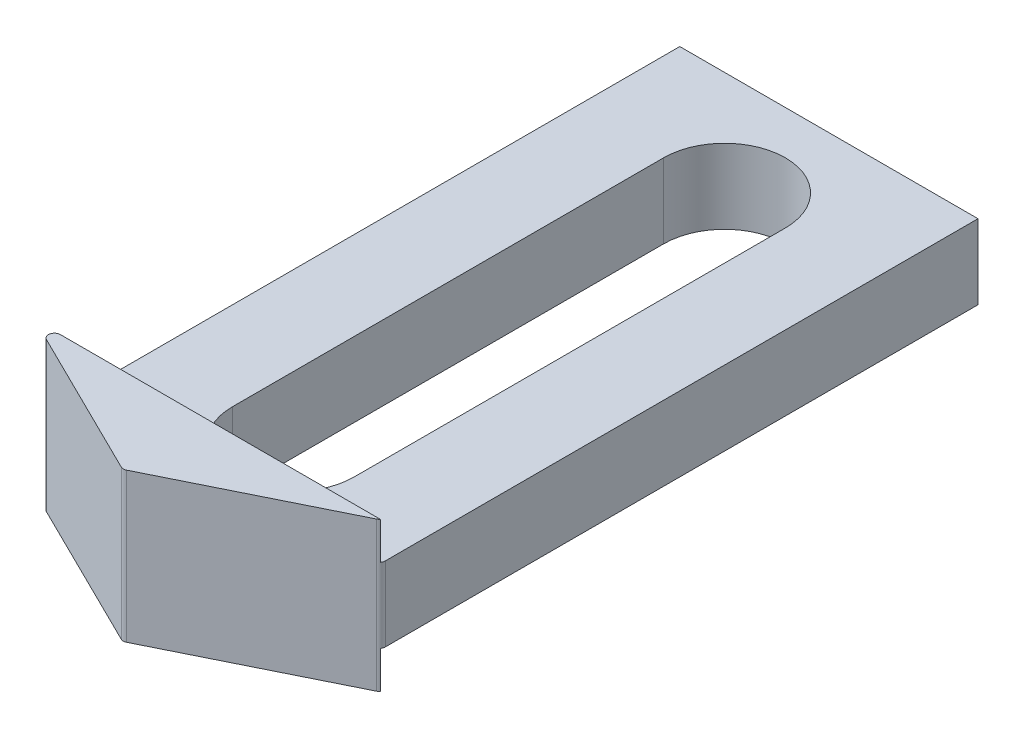
ISO-10303-21;
HEADER;
FILE_DESCRIPTION(('STEP AP214'),'2;1');
FILE_NAME('part.step','',(''),(''),'','','');
FILE_SCHEMA(('AUTOMOTIVE_DESIGN { 1 0 10303 214 1 1 1 1 }'));
ENDSEC;
DATA;
#1=APPLICATION_CONTEXT('core data for automotive mechanical design processes');
#2=APPLICATION_PROTOCOL_DEFINITION('international standard','automotive_design',2000,#1);
#3=PRODUCT_CONTEXT('',#1,'mechanical');
#4=PRODUCT('Part','Part','',(#3));
#5=PRODUCT_RELATED_PRODUCT_CATEGORY('part','',(#4));
#6=PRODUCT_DEFINITION_FORMATION('','',#4);
#7=PRODUCT_DEFINITION_CONTEXT('part definition',#1,'design');
#8=PRODUCT_DEFINITION('design','',#6,#7);
#9=PRODUCT_DEFINITION_SHAPE('','',#8);
#10=(LENGTH_UNIT() NAMED_UNIT(*) SI_UNIT(.MILLI.,.METRE.));
#11=(NAMED_UNIT(*) PLANE_ANGLE_UNIT() SI_UNIT($,.RADIAN.));
#12=(NAMED_UNIT(*) SI_UNIT($,.STERADIAN.) SOLID_ANGLE_UNIT());
#13=UNCERTAINTY_MEASURE_WITH_UNIT(LENGTH_MEASURE(1.E-05),#10,'distance_accuracy_value','');
#14=(GEOMETRIC_REPRESENTATION_CONTEXT(3) GLOBAL_UNCERTAINTY_ASSIGNED_CONTEXT((#13)) GLOBAL_UNIT_ASSIGNED_CONTEXT((#10,
#11,#12)) REPRESENTATION_CONTEXT('',''));
#15=CARTESIAN_POINT('',(0.,0.,0.));
#16=DIRECTION('',(0.,0.,1.));
#17=DIRECTION('',(1.,0.,0.));
#18=AXIS2_PLACEMENT_3D('',#15,#16,#17);
#19=CARTESIAN_POINT('',(0.,3.175,0.));
#20=DIRECTION('',(0.,0.,-1.));
#21=DIRECTION('',(-1.,0.,0.));
#22=AXIS2_PLACEMENT_3D('',#19,#20,#21);
#23=PLANE('',#22);
#24=DIRECTION('',(0.,-1.,0.));
#25=VECTOR('',#24,1.);
#26=CARTESIAN_POINT('',(1.49142990286922,3.175,0.));
#27=LINE('',#26,#25);
#28=CARTESIAN_POINT('',(1.49142990286922,-3.175,0.));
#29=VERTEX_POINT('',#28);
#30=CARTESIAN_POINT('',(1.49142990286922,3.175,0.));
#31=VERTEX_POINT('',#30);
#32=EDGE_CURVE('E192',#29,#31,#27,.F.);
#33=ORIENTED_EDGE('',*,*,#32,.T.);
#34=DIRECTION('',(1.,0.,0.));
#35=VECTOR('',#34,1.);
#36=CARTESIAN_POINT('',(0.,3.175,0.));
#37=LINE('',#36,#35);
#38=CARTESIAN_POINT('',(15.1141063698207,3.175,0.));
#39=VERTEX_POINT('',#38);
#40=EDGE_CURVE('E275',#31,#39,#37,.T.);
#41=ORIENTED_EDGE('',*,*,#40,.T.);
#42=DIRECTION('',(0.,1.,0.));
#43=VECTOR('',#42,1.);
#44=CARTESIAN_POINT('',(15.1141063698207,3.175,0.));
#45=LINE('',#44,#43);
#46=CARTESIAN_POINT('',(15.1141063698207,1.5875,0.));
#47=VERTEX_POINT('',#46);
#48=EDGE_CURVE('E265',#39,#47,#45,.F.);
#49=ORIENTED_EDGE('',*,*,#48,.T.);
#50=DIRECTION('',(-1.,0.,0.));
#51=VECTOR('',#50,1.);
#52=CARTESIAN_POINT('',(15.1691141584862,1.5875,0.));
#53=LINE('',#52,#51);
#54=CARTESIAN_POINT('',(8.81911415848617,1.5875,0.));
#55=VERTEX_POINT('',#54);
#56=EDGE_CURVE('E59',#47,#55,#53,.T.);
#57=ORIENTED_EDGE('',*,*,#56,.T.);
#58=CARTESIAN_POINT('',(2.21511415848617,1.5875,0.));
#59=VERTEX_POINT('',#58);
#60=EDGE_CURVE('E186',#55,#59,#53,.T.);
#61=ORIENTED_EDGE('',*,*,#60,.T.);
#62=DIRECTION('',(0.,-1.,0.));
#63=VECTOR('',#62,1.);
#64=CARTESIAN_POINT('',(2.21511415848617,3.175,0.));
#65=LINE('',#64,#63);
#66=CARTESIAN_POINT('',(2.21511415848617,-1.5875,0.));
#67=VERTEX_POINT('',#66);
#68=EDGE_CURVE('E196',#59,#67,#65,.T.);
#69=ORIENTED_EDGE('',*,*,#68,.T.);
#70=DIRECTION('',(-1.,0.,0.));
#71=VECTOR('',#70,1.);
#72=CARTESIAN_POINT('',(15.1691141584862,-1.5875,0.));
#73=LINE('',#72,#71);
#74=CARTESIAN_POINT('',(8.81911415848617,-1.5875,0.));
#75=VERTEX_POINT('',#74);
#76=EDGE_CURVE('E390',#75,#67,#73,.T.);
#77=ORIENTED_EDGE('',*,*,#76,.F.);
#78=CARTESIAN_POINT('',(15.1141063698207,-1.5875,0.));
#79=VERTEX_POINT('',#78);
#80=EDGE_CURVE('E67',#79,#75,#73,.T.);
#81=ORIENTED_EDGE('',*,*,#80,.F.);
#82=DIRECTION('',(0.,1.,0.));
#83=VECTOR('',#82,1.);
#84=CARTESIAN_POINT('',(15.1141063698207,3.175,0.));
#85=LINE('',#84,#83);
#86=CARTESIAN_POINT('',(15.1141063698207,-3.175,0.));
#87=VERTEX_POINT('',#86);
#88=EDGE_CURVE('E271',#79,#87,#85,.F.);
#89=ORIENTED_EDGE('',*,*,#88,.T.);
#90=DIRECTION('',(1.,0.,0.));
#91=VECTOR('',#90,1.);
#92=CARTESIAN_POINT('',(0.,-3.175,0.));
#93=LINE('',#92,#91);
#94=EDGE_CURVE('E286',#29,#87,#93,.T.);
#95=ORIENTED_EDGE('',*,*,#94,.F.);
#96=EDGE_LOOP('',(#33,#41,#49,#57,#61,#69,#77,#81,#89,#95));
#97=FACE_BOUND('',#96,.T.);
#98=ADVANCED_FACE('F43',(#97),#23,.T.);
#99=CARTESIAN_POINT('',(0.0790770314002346,3.175,-0.160139833938414));
#100=DIRECTION('',(-0.442760649996561,0.,0.896639842308283));
#101=DIRECTION('',(0.896639842308283,0.,0.442760649996561));
#102=AXIS2_PLACEMENT_3D('',#99,#100,#101);
#103=PLANE('',#102);
#104=DIRECTION('',(-0.896639842308283,0.,-0.442760649996561));
#105=VECTOR('',#104,1.);
#106=CARTESIAN_POINT('',(0.0790770314002346,3.175,-0.160139833938414));
#107=LINE('',#106,#105);
#108=CARTESIAN_POINT('',(7.67378492812128,3.175,3.59012604341715));
#109=VERTEX_POINT('',#108);
#110=CARTESIAN_POINT('',(1.3789686977701,3.175,0.481746519946304));
#111=VERTEX_POINT('',#110);
#112=EDGE_CURVE('E278',#109,#111,#107,.T.);
#113=ORIENTED_EDGE('',*,*,#112,.T.);
#114=DIRECTION('',(0.,-1.,0.));
#115=VECTOR('',#114,1.);
#116=CARTESIAN_POINT('',(1.3789686977701,3.175,0.481746519946304));
#117=LINE('',#116,#115);
#118=CARTESIAN_POINT('',(1.3789686977701,-3.175,0.481746519946304));
#119=VERTEX_POINT('',#118);
#120=EDGE_CURVE('E241',#111,#119,#117,.T.);
#121=ORIENTED_EDGE('',*,*,#120,.T.);
#122=DIRECTION('',(-0.896639842308283,0.,-0.442760649996561));
#123=VECTOR('',#122,1.);
#124=CARTESIAN_POINT('',(0.0790770314002346,-3.175,-0.160139833938414));
#125=LINE('',#124,#123);
#126=CARTESIAN_POINT('',(7.67378492812128,-3.175,3.59012604341715));
#127=VERTEX_POINT('',#126);
#128=EDGE_CURVE('E289',#127,#119,#125,.T.);
#129=ORIENTED_EDGE('',*,*,#128,.F.);
#130=DIRECTION('',(0.,-1.,0.));
#131=VECTOR('',#130,1.);
#132=CARTESIAN_POINT('',(7.67378492812128,3.175,3.59012604341715));
#133=LINE('',#132,#131);
#134=EDGE_CURVE('E238',#127,#109,#133,.F.);
#135=ORIENTED_EDGE('',*,*,#134,.T.);
#136=EDGE_LOOP('',(#113,#121,#129,#135));
#137=FACE_BOUND('',#136,.T.);
#138=ADVANCED_FACE('F319',(#137),#103,.T.);
#139=CARTESIAN_POINT('',(2.97370752891536,3.175,6.0220903773141));
#140=DIRECTION('',(0.442760649996561,0.,0.896639842308283));
#141=DIRECTION('',(0.896639842308283,0.,-0.442760649996561));
#142=AXIS2_PLACEMENT_3D('',#139,#140,#141);
#143=PLANE('',#142);
#144=DIRECTION('',(-0.896639842308283,0.,0.442760649996561));
#145=VECTOR('',#144,1.);
#146=CARTESIAN_POINT('',(2.97370752891536,-3.175,6.0220903773141));
#147=LINE('',#146,#145);
#148=CARTESIAN_POINT('',(15.0275753635853,-3.175,0.0698918404838109));
#149=VERTEX_POINT('',#148);
#150=CARTESIAN_POINT('',(7.89870733831954,-3.175,3.59012604341715));
#151=VERTEX_POINT('',#150);
#152=EDGE_CURVE('E279',#149,#151,#147,.T.);
#153=ORIENTED_EDGE('',*,*,#152,.F.);
#154=DIRECTION('',(0.,-1.,0.));
#155=VECTOR('',#154,1.);
#156=CARTESIAN_POINT('',(15.0275753635853,3.175,0.0698918404838117));
#157=LINE('',#156,#155);
#158=CARTESIAN_POINT('',(15.0275753635853,3.175,0.0698918404838109));
#159=VERTEX_POINT('',#158);
#160=EDGE_CURVE('E225',#149,#159,#157,.F.);
#161=ORIENTED_EDGE('',*,*,#160,.T.);
#162=DIRECTION('',(-0.896639842308283,0.,0.442760649996561));
#163=VECTOR('',#162,1.);
#164=CARTESIAN_POINT('',(2.97370752891536,3.175,6.0220903773141));
#165=LINE('',#164,#163);
#166=CARTESIAN_POINT('',(7.89870733831954,3.175,3.59012604341715));
#167=VERTEX_POINT('',#166);
#168=EDGE_CURVE('E198',#159,#167,#165,.T.);
#169=ORIENTED_EDGE('',*,*,#168,.T.);
#170=DIRECTION('',(0.,-1.,0.));
#171=VECTOR('',#170,1.);
#172=CARTESIAN_POINT('',(7.89870733831953,3.175,3.59012604341715));
#173=LINE('',#172,#171);
#174=EDGE_CURVE('E221',#167,#151,#173,.T.);
#175=ORIENTED_EDGE('',*,*,#174,.T.);
#176=EDGE_LOOP('',(#153,#161,#169,#175));
#177=FACE_BOUND('',#176,.T.);
#178=ADVANCED_FACE('F302',(#177),#143,.T.);
#179=CARTESIAN_POINT('',(15.1691141584862,3.175,0.));
#180=DIRECTION('',(-1.,0.,0.));
#181=DIRECTION('',(0.,0.,1.));
#182=AXIS2_PLACEMENT_3D('',#179,#180,#181);
#183=PLANE('',#182);
#184=DIRECTION('',(0.,-1.,0.));
#185=VECTOR('',#184,1.);
#186=CARTESIAN_POINT('',(15.1691141584862,3.175,-25.4));
#187=LINE('',#186,#185);
#188=CARTESIAN_POINT('',(15.1691141584862,1.5875,-25.4));
#189=VERTEX_POINT('',#188);
#190=CARTESIAN_POINT('',(15.1691141584862,-1.5875,-25.4));
#191=VERTEX_POINT('',#190);
#192=EDGE_CURVE('E182',#189,#191,#187,.T.);
#193=ORIENTED_EDGE('',*,*,#192,.F.);
#194=DIRECTION('',(0.,0.,1.));
#195=VECTOR('',#194,1.);
#196=CARTESIAN_POINT('',(15.1691141584862,1.5875,-25.4));
#197=LINE('',#196,#195);
#198=CARTESIAN_POINT('',(15.1691141584862,1.5875,-0.157854679462492));
#199=VERTEX_POINT('',#198);
#200=EDGE_CURVE('E163',#189,#199,#197,.T.);
#201=ORIENTED_EDGE('',*,*,#200,.T.);
#202=DIRECTION('',(0.,-1.,0.));
#203=VECTOR('',#202,1.);
#204=CARTESIAN_POINT('',(15.1691141584862,-3.175,-0.157854679462492));
#205=LINE('',#204,#203);
#206=CARTESIAN_POINT('',(15.1691141584862,-1.5875,-0.157854679462492));
#207=VERTEX_POINT('',#206);
#208=EDGE_CURVE('E209',#199,#207,#205,.T.);
#209=ORIENTED_EDGE('',*,*,#208,.T.);
#210=DIRECTION('',(0.,0.,-1.));
#211=VECTOR('',#210,1.);
#212=CARTESIAN_POINT('',(15.1691141584862,-1.5875,-25.4));
#213=LINE('',#212,#211);
#214=EDGE_CURVE('E190',#207,#191,#213,.T.);
#215=ORIENTED_EDGE('',*,*,#214,.T.);
#216=EDGE_LOOP('',(#193,#201,#209,#215));
#217=FACE_BOUND('',#216,.T.);
#218=ADVANCED_FACE('F189',(#217),#183,.F.);
#219=CARTESIAN_POINT('',(0.,3.175,-25.4));
#220=DIRECTION('',(0.,0.,-1.));
#221=DIRECTION('',(-1.,0.,0.));
#222=AXIS2_PLACEMENT_3D('',#219,#220,#221);
#223=PLANE('',#222);
#224=DIRECTION('',(-1.,0.,0.));
#225=VECTOR('',#224,1.);
#226=CARTESIAN_POINT('',(15.1691141584862,1.5875,-25.4));
#227=LINE('',#226,#225);
#228=CARTESIAN_POINT('',(2.46911415848617,1.5875,-25.4));
#229=VERTEX_POINT('',#228);
#230=EDGE_CURVE('E166',#189,#229,#227,.T.);
#231=ORIENTED_EDGE('',*,*,#230,.F.);
#232=ORIENTED_EDGE('',*,*,#192,.T.);
#233=DIRECTION('',(-1.,0.,0.));
#234=VECTOR('',#233,1.);
#235=CARTESIAN_POINT('',(15.1691141584862,-1.5875,-25.4));
#236=LINE('',#235,#234);
#237=CARTESIAN_POINT('',(2.46911415848617,-1.5875,-25.4));
#238=VERTEX_POINT('',#237);
#239=EDGE_CURVE('E175',#191,#238,#236,.T.);
#240=ORIENTED_EDGE('',*,*,#239,.T.);
#241=DIRECTION('',(0.,-1.,0.));
#242=VECTOR('',#241,1.);
#243=CARTESIAN_POINT('',(2.46911415848617,3.175,-25.4));
#244=LINE('',#243,#242);
#245=EDGE_CURVE('E184',#229,#238,#244,.T.);
#246=ORIENTED_EDGE('',*,*,#245,.F.);
#247=EDGE_LOOP('',(#231,#232,#240,#246));
#248=FACE_BOUND('',#247,.T.);
#249=ADVANCED_FACE('F180',(#248),#223,.T.);
#250=CARTESIAN_POINT('',(2.46911415848617,3.175,0.));
#251=DIRECTION('',(1.,0.,0.));
#252=DIRECTION('',(0.,0.,-1.));
#253=AXIS2_PLACEMENT_3D('',#250,#251,#252);
#254=PLANE('',#253);
#255=DIRECTION('',(0.,-1.,0.));
#256=VECTOR('',#255,1.);
#257=CARTESIAN_POINT('',(2.46911415848617,3.175,-0.254));
#258=LINE('',#257,#256);
#259=CARTESIAN_POINT('',(2.46911415848617,-1.5875,-0.254));
#260=VERTEX_POINT('',#259);
#261=CARTESIAN_POINT('',(2.46911415848617,1.5875,-0.254));
#262=VERTEX_POINT('',#261);
#263=EDGE_CURVE('E205',#260,#262,#258,.F.);
#264=ORIENTED_EDGE('',*,*,#263,.T.);
#265=DIRECTION('',(0.,0.,-1.));
#266=VECTOR('',#265,1.);
#267=CARTESIAN_POINT('',(2.46911415848617,1.5875,0.));
#268=LINE('',#267,#266);
#269=EDGE_CURVE('E327',#262,#229,#268,.T.);
#270=ORIENTED_EDGE('',*,*,#269,.T.);
#271=ORIENTED_EDGE('',*,*,#245,.T.);
#272=DIRECTION('',(0.,0.,1.));
#273=VECTOR('',#272,1.);
#274=CARTESIAN_POINT('',(2.46911415848617,-1.5875,0.));
#275=LINE('',#274,#273);
#276=EDGE_CURVE('E358',#238,#260,#275,.T.);
#277=ORIENTED_EDGE('',*,*,#276,.T.);
#278=EDGE_LOOP('',(#264,#270,#271,#277));
#279=FACE_BOUND('',#278,.T.);
#280=ADVANCED_FACE('F375',(#279),#254,.F.);
#281=CARTESIAN_POINT('',(0.,3.175,0.));
#282=DIRECTION('',(0.,1.,0.));
#283=DIRECTION('',(0.,0.,1.));
#284=AXIS2_PLACEMENT_3D('',#281,#282,#283);
#285=PLANE('',#284);
#286=CARTESIAN_POINT('',(14.9151141584862,3.175,-0.157854679462492));
#287=DIRECTION('',(0.,1.,0.));
#288=DIRECTION('',(0.,0.,1.));
#289=AXIS2_PLACEMENT_3D('',#286,#287,#288);
#290=CIRCLE('',#289,0.254);
#291=EDGE_CURVE('E234',#159,#39,#290,.T.);
#292=ORIENTED_EDGE('',*,*,#291,.T.);
#293=ORIENTED_EDGE('',*,*,#40,.F.);
#294=CARTESIAN_POINT('',(1.49142990286922,3.175,0.254));
#295=DIRECTION('',(0.,1.,0.));
#296=DIRECTION('',(0.,0.,1.));
#297=AXIS2_PLACEMENT_3D('',#294,#295,#296);
#298=CIRCLE('',#297,0.254);
#299=EDGE_CURVE('E231',#31,#111,#298,.T.);
#300=ORIENTED_EDGE('',*,*,#299,.T.);
#301=ORIENTED_EDGE('',*,*,#112,.F.);
#302=CARTESIAN_POINT('',(7.78624613322041,3.175,3.36237952347084));
#303=DIRECTION('',(0.,1.,0.));
#304=DIRECTION('',(0.,0.,1.));
#305=AXIS2_PLACEMENT_3D('',#302,#303,#304);
#306=CIRCLE('',#305,0.254);
#307=EDGE_CURVE('E228',#109,#167,#306,.T.);
#308=ORIENTED_EDGE('',*,*,#307,.T.);
#309=ORIENTED_EDGE('',*,*,#168,.F.);
#310=EDGE_LOOP('',(#292,#293,#300,#301,#308,#309));
#311=FACE_BOUND('',#310,.T.);
#312=ADVANCED_FACE('F312',(#311),#285,.T.);
#313=CARTESIAN_POINT('',(0.,-3.175,0.));
#314=DIRECTION('',(0.,1.,0.));
#315=DIRECTION('',(0.,0.,1.));
#316=AXIS2_PLACEMENT_3D('',#313,#314,#315);
#317=PLANE('',#316);
#318=ORIENTED_EDGE('',*,*,#94,.T.);
#319=CARTESIAN_POINT('',(14.9151141584862,-3.175,-0.157854679462492));
#320=DIRECTION('',(0.,1.,0.));
#321=DIRECTION('',(0.,0.,1.));
#322=AXIS2_PLACEMENT_3D('',#319,#320,#321);
#323=CIRCLE('',#322,0.254);
#324=EDGE_CURVE('E218',#87,#149,#323,.F.);
#325=ORIENTED_EDGE('',*,*,#324,.T.);
#326=ORIENTED_EDGE('',*,*,#152,.T.);
#327=CARTESIAN_POINT('',(7.78624613322041,-3.175,3.36237952347084));
#328=DIRECTION('',(0.,1.,0.));
#329=DIRECTION('',(0.,0.,1.));
#330=AXIS2_PLACEMENT_3D('',#327,#328,#329);
#331=CIRCLE('',#330,0.254);
#332=EDGE_CURVE('E212',#151,#127,#331,.F.);
#333=ORIENTED_EDGE('',*,*,#332,.T.);
#334=ORIENTED_EDGE('',*,*,#128,.T.);
#335=CARTESIAN_POINT('',(1.49142990286922,-3.175,0.254));
#336=DIRECTION('',(0.,1.,0.));
#337=DIRECTION('',(0.,0.,1.));
#338=AXIS2_PLACEMENT_3D('',#335,#336,#337);
#339=CIRCLE('',#338,0.254);
#340=EDGE_CURVE('E215',#119,#29,#339,.F.);
#341=ORIENTED_EDGE('',*,*,#340,.T.);
#342=EDGE_LOOP('',(#318,#325,#326,#333,#334,#341));
#343=FACE_BOUND('',#342,.T.);
#344=ADVANCED_FACE('F297',(#343),#317,.F.);
#345=CARTESIAN_POINT('',(2.21511415848617,3.175,-0.254));
#346=DIRECTION('',(0.,-1.,0.));
#347=DIRECTION('',(0.,0.,-1.));
#348=AXIS2_PLACEMENT_3D('',#345,#346,#347);
#349=CYLINDRICAL_SURFACE('',#348,0.254);
#350=ORIENTED_EDGE('',*,*,#68,.F.);
#351=CARTESIAN_POINT('',(2.21511415848617,1.5875,-0.254));
#352=DIRECTION('',(0.,-1.,0.));
#353=DIRECTION('',(0.,0.,-1.));
#354=AXIS2_PLACEMENT_3D('',#351,#352,#353);
#355=CIRCLE('',#354,0.254);
#356=EDGE_CURVE('E330',#59,#262,#355,.F.);
#357=ORIENTED_EDGE('',*,*,#356,.T.);
#358=ORIENTED_EDGE('',*,*,#263,.F.);
#359=CARTESIAN_POINT('',(2.21511415848617,-1.5875,-0.254));
#360=DIRECTION('',(0.,1.,0.));
#361=DIRECTION('',(0.,0.,1.));
#362=AXIS2_PLACEMENT_3D('',#359,#360,#361);
#363=CIRCLE('',#362,0.254);
#364=EDGE_CURVE('E377',#260,#67,#363,.F.);
#365=ORIENTED_EDGE('',*,*,#364,.T.);
#366=EDGE_LOOP('',(#350,#357,#358,#365));
#367=FACE_BOUND('',#366,.T.);
#368=ADVANCED_FACE('F370',(#367),#349,.F.);
#369=CARTESIAN_POINT('',(14.9151141584862,3.175,-0.157854679462492));
#370=DIRECTION('',(0.,1.,0.));
#371=DIRECTION('',(0.,0.,1.));
#372=AXIS2_PLACEMENT_3D('',#369,#370,#371);
#373=CYLINDRICAL_SURFACE('',#372,0.254);
#374=ORIENTED_EDGE('',*,*,#48,.F.);
#375=ORIENTED_EDGE('',*,*,#291,.F.);
#376=ORIENTED_EDGE('',*,*,#160,.F.);
#377=ORIENTED_EDGE('',*,*,#324,.F.);
#378=ORIENTED_EDGE('',*,*,#88,.F.);
#379=CARTESIAN_POINT('',(14.9151141584862,-1.5875,-0.157854679462492));
#380=DIRECTION('',(0.,1.,0.));
#381=DIRECTION('',(0.,0.,1.));
#382=AXIS2_PLACEMENT_3D('',#379,#380,#381);
#383=CIRCLE('',#382,0.254);
#384=EDGE_CURVE('E379',#207,#79,#383,.F.);
#385=ORIENTED_EDGE('',*,*,#384,.F.);
#386=ORIENTED_EDGE('',*,*,#208,.F.);
#387=CARTESIAN_POINT('',(14.9151141584862,1.5875,-0.157854679462492));
#388=DIRECTION('',(0.,-1.,0.));
#389=DIRECTION('',(0.,0.,-1.));
#390=AXIS2_PLACEMENT_3D('',#387,#388,#389);
#391=CIRCLE('',#390,0.254);
#392=EDGE_CURVE('E169',#47,#199,#391,.F.);
#393=ORIENTED_EDGE('',*,*,#392,.F.);
#394=EDGE_LOOP('',(#374,#375,#376,#377,#378,#385,#386,#393));
#395=FACE_BOUND('',#394,.T.);
#396=ADVANCED_FACE('F308',(#395),#373,.T.);
#397=CARTESIAN_POINT('',(1.49142990286922,3.175,0.254));
#398=DIRECTION('',(0.,-1.,0.));
#399=DIRECTION('',(0.,0.,-1.));
#400=AXIS2_PLACEMENT_3D('',#397,#398,#399);
#401=CYLINDRICAL_SURFACE('',#400,0.254);
#402=ORIENTED_EDGE('',*,*,#299,.F.);
#403=ORIENTED_EDGE('',*,*,#32,.F.);
#404=ORIENTED_EDGE('',*,*,#340,.F.);
#405=ORIENTED_EDGE('',*,*,#120,.F.);
#406=EDGE_LOOP('',(#402,#403,#404,#405));
#407=FACE_BOUND('',#406,.T.);
#408=ADVANCED_FACE('F323',(#407),#401,.T.);
#409=CARTESIAN_POINT('',(7.78624613322041,3.175,3.36237952347084));
#410=DIRECTION('',(0.,-1.,0.));
#411=DIRECTION('',(0.,0.,-1.));
#412=AXIS2_PLACEMENT_3D('',#409,#410,#411);
#413=CYLINDRICAL_SURFACE('',#412,0.254);
#414=ORIENTED_EDGE('',*,*,#307,.F.);
#415=ORIENTED_EDGE('',*,*,#134,.F.);
#416=ORIENTED_EDGE('',*,*,#332,.F.);
#417=ORIENTED_EDGE('',*,*,#174,.F.);
#418=EDGE_LOOP('',(#414,#415,#416,#417));
#419=FACE_BOUND('',#418,.T.);
#420=ADVANCED_FACE('F45',(#419),#413,.T.);
#421=CARTESIAN_POINT('',(15.1691141584862,-1.5875,-25.4));
#422=DIRECTION('',(0.,1.,0.));
#423=DIRECTION('',(0.,0.,1.));
#424=AXIS2_PLACEMENT_3D('',#421,#422,#423);
#425=PLANE('',#424);
#426=ORIENTED_EDGE('',*,*,#239,.F.);
#427=ORIENTED_EDGE('',*,*,#214,.F.);
#428=ORIENTED_EDGE('',*,*,#384,.T.);
#429=ORIENTED_EDGE('',*,*,#80,.T.);
#430=CARTESIAN_POINT('',(8.81911415848617,-1.5875,-2.5908));
#431=DIRECTION('',(0.,1.,0.));
#432=DIRECTION('',(0.,0.,1.));
#433=AXIS2_PLACEMENT_3D('',#430,#431,#432);
#434=CIRCLE('',#433,2.5908);
#435=CARTESIAN_POINT('',(11.4099141584862,-1.5875,-2.5908));
#436=VERTEX_POINT('',#435);
#437=EDGE_CURVE('E349',#436,#75,#434,.F.);
#438=ORIENTED_EDGE('',*,*,#437,.F.);
#439=DIRECTION('',(0.,0.,1.));
#440=VECTOR('',#439,1.);
#441=CARTESIAN_POINT('',(11.4099141584862,-1.5875,-20.955));
#442=LINE('',#441,#440);
#443=CARTESIAN_POINT('',(11.4099141584862,-1.5875,-20.955));
#444=VERTEX_POINT('',#443);
#445=EDGE_CURVE('E343',#444,#436,#442,.T.);
#446=ORIENTED_EDGE('',*,*,#445,.F.);
#447=CARTESIAN_POINT('',(8.81911415848617,-1.5875,-20.955));
#448=DIRECTION('',(0.,1.,0.));
#449=DIRECTION('',(0.,0.,1.));
#450=AXIS2_PLACEMENT_3D('',#447,#448,#449);
#451=CIRCLE('',#450,2.5908);
#452=CARTESIAN_POINT('',(6.22831415848617,-1.5875,-20.955));
#453=VERTEX_POINT('',#452);
#454=EDGE_CURVE('E261',#453,#444,#451,.F.);
#455=ORIENTED_EDGE('',*,*,#454,.F.);
#456=DIRECTION('',(0.,0.,-1.));
#457=VECTOR('',#456,1.);
#458=CARTESIAN_POINT('',(6.22831415848617,-1.5875,-20.955));
#459=LINE('',#458,#457);
#460=CARTESIAN_POINT('',(6.22831415848617,-1.5875,-2.5908));
#461=VERTEX_POINT('',#460);
#462=EDGE_CURVE('E52',#461,#453,#459,.T.);
#463=ORIENTED_EDGE('',*,*,#462,.F.);
#464=EDGE_CURVE('E387',#75,#461,#434,.F.);
#465=ORIENTED_EDGE('',*,*,#464,.F.);
#466=ORIENTED_EDGE('',*,*,#76,.T.);
#467=ORIENTED_EDGE('',*,*,#364,.F.);
#468=ORIENTED_EDGE('',*,*,#276,.F.);
#469=EDGE_LOOP('',(#426,#427,#428,#429,#438,#446,#455,#463,#465,#466,#467,#468));
#470=FACE_BOUND('',#469,.T.);
#471=ADVANCED_FACE('F399',(#470),#425,.F.);
#472=CARTESIAN_POINT('',(15.1691141584862,1.5875,-25.4));
#473=DIRECTION('',(0.,-1.,0.));
#474=DIRECTION('',(0.,0.,-1.));
#475=AXIS2_PLACEMENT_3D('',#472,#473,#474);
#476=PLANE('',#475);
#477=ORIENTED_EDGE('',*,*,#356,.F.);
#478=ORIENTED_EDGE('',*,*,#60,.F.);
#479=CARTESIAN_POINT('',(8.81911415848617,1.5875,-2.5908));
#480=DIRECTION('',(0.,-1.,0.));
#481=DIRECTION('',(0.,0.,-1.));
#482=AXIS2_PLACEMENT_3D('',#479,#480,#481);
#483=CIRCLE('',#482,2.5908);
#484=CARTESIAN_POINT('',(6.22831415848617,1.5875,-2.5908));
#485=VERTEX_POINT('',#484);
#486=EDGE_CURVE('E351',#485,#55,#483,.F.);
#487=ORIENTED_EDGE('',*,*,#486,.F.);
#488=DIRECTION('',(0.,0.,1.));
#489=VECTOR('',#488,1.);
#490=CARTESIAN_POINT('',(6.22831415848617,1.5875,-20.955));
#491=LINE('',#490,#489);
#492=CARTESIAN_POINT('',(6.22831415848617,1.5875,-20.955));
#493=VERTEX_POINT('',#492);
#494=EDGE_CURVE('E11',#493,#485,#491,.T.);
#495=ORIENTED_EDGE('',*,*,#494,.F.);
#496=CARTESIAN_POINT('',(8.81911415848617,1.5875,-20.955));
#497=DIRECTION('',(0.,-1.,0.));
#498=DIRECTION('',(0.,0.,-1.));
#499=AXIS2_PLACEMENT_3D('',#496,#497,#498);
#500=CIRCLE('',#499,2.5908);
#501=CARTESIAN_POINT('',(11.4099141584862,1.5875,-20.955));
#502=VERTEX_POINT('',#501);
#503=EDGE_CURVE('E263',#502,#493,#500,.F.);
#504=ORIENTED_EDGE('',*,*,#503,.F.);
#505=DIRECTION('',(0.,0.,-1.));
#506=VECTOR('',#505,1.);
#507=CARTESIAN_POINT('',(11.4099141584862,1.5875,-20.955));
#508=LINE('',#507,#506);
#509=CARTESIAN_POINT('',(11.4099141584862,1.5875,-2.5908));
#510=VERTEX_POINT('',#509);
#511=EDGE_CURVE('E342',#510,#502,#508,.T.);
#512=ORIENTED_EDGE('',*,*,#511,.F.);
#513=EDGE_CURVE('E350',#55,#510,#483,.F.);
#514=ORIENTED_EDGE('',*,*,#513,.F.);
#515=ORIENTED_EDGE('',*,*,#56,.F.);
#516=ORIENTED_EDGE('',*,*,#392,.T.);
#517=ORIENTED_EDGE('',*,*,#200,.F.);
#518=ORIENTED_EDGE('',*,*,#230,.T.);
#519=ORIENTED_EDGE('',*,*,#269,.F.);
#520=EDGE_LOOP('',(#477,#478,#487,#495,#504,#512,#514,#515,#516,#517,#518,#519));
#521=FACE_BOUND('',#520,.T.);
#522=ADVANCED_FACE('F165',(#521),#476,.F.);
#523=CARTESIAN_POINT('',(6.22831415848617,-3.176,-20.955));
#524=DIRECTION('',(-1.,0.,0.));
#525=DIRECTION('',(0.,0.,1.));
#526=AXIS2_PLACEMENT_3D('',#523,#524,#525);
#527=PLANE('',#526);
#528=DIRECTION('',(0.,1.,0.));
#529=VECTOR('',#528,1.);
#530=CARTESIAN_POINT('',(6.22831415848617,-3.176,-20.955));
#531=LINE('',#530,#529);
#532=EDGE_CURVE('E251',#453,#493,#531,.T.);
#533=ORIENTED_EDGE('',*,*,#532,.T.);
#534=ORIENTED_EDGE('',*,*,#494,.T.);
#535=DIRECTION('',(0.,1.,0.));
#536=VECTOR('',#535,1.);
#537=CARTESIAN_POINT('',(6.22831415848617,-3.176,-2.5908));
#538=LINE('',#537,#536);
#539=EDGE_CURVE('E253',#461,#485,#538,.T.);
#540=ORIENTED_EDGE('',*,*,#539,.F.);
#541=ORIENTED_EDGE('',*,*,#462,.T.);
#542=EDGE_LOOP('',(#533,#534,#540,#541));
#543=FACE_BOUND('',#542,.T.);
#544=ADVANCED_FACE('F250',(#543),#527,.F.);
#545=CARTESIAN_POINT('',(8.81911415848617,-3.176,-2.5908));
#546=DIRECTION('',(0.,1.,0.));
#547=DIRECTION('',(0.,0.,1.));
#548=AXIS2_PLACEMENT_3D('',#545,#546,#547);
#549=CYLINDRICAL_SURFACE('',#548,2.5908);
#550=ORIENTED_EDGE('',*,*,#486,.T.);
#551=ORIENTED_EDGE('',*,*,#513,.T.);
#552=DIRECTION('',(0.,1.,0.));
#553=VECTOR('',#552,1.);
#554=CARTESIAN_POINT('',(11.4099141584862,-3.176,-2.5908));
#555=LINE('',#554,#553);
#556=EDGE_CURVE('E269',#436,#510,#555,.T.);
#557=ORIENTED_EDGE('',*,*,#556,.F.);
#558=ORIENTED_EDGE('',*,*,#437,.T.);
#559=ORIENTED_EDGE('',*,*,#464,.T.);
#560=ORIENTED_EDGE('',*,*,#539,.T.);
#561=EDGE_LOOP('',(#550,#551,#557,#558,#559,#560));
#562=FACE_BOUND('',#561,.T.);
#563=ADVANCED_FACE('F348',(#562),#549,.F.);
#564=CARTESIAN_POINT('',(11.4099141584862,-3.176,-20.955));
#565=DIRECTION('',(1.,0.,0.));
#566=DIRECTION('',(0.,0.,-1.));
#567=AXIS2_PLACEMENT_3D('',#564,#565,#566);
#568=PLANE('',#567);
#569=ORIENTED_EDGE('',*,*,#556,.T.);
#570=ORIENTED_EDGE('',*,*,#511,.T.);
#571=DIRECTION('',(0.,1.,0.));
#572=VECTOR('',#571,1.);
#573=CARTESIAN_POINT('',(11.4099141584862,-3.176,-20.955));
#574=LINE('',#573,#572);
#575=EDGE_CURVE('E290',#444,#502,#574,.T.);
#576=ORIENTED_EDGE('',*,*,#575,.F.);
#577=ORIENTED_EDGE('',*,*,#445,.T.);
#578=EDGE_LOOP('',(#569,#570,#576,#577));
#579=FACE_BOUND('',#578,.T.);
#580=ADVANCED_FACE('F341',(#579),#568,.F.);
#581=CARTESIAN_POINT('',(8.81911415848617,-3.176,-20.955));
#582=DIRECTION('',(0.,1.,0.));
#583=DIRECTION('',(0.,0.,1.));
#584=AXIS2_PLACEMENT_3D('',#581,#582,#583);
#585=CYLINDRICAL_SURFACE('',#584,2.5908);
#586=ORIENTED_EDGE('',*,*,#575,.T.);
#587=ORIENTED_EDGE('',*,*,#503,.T.);
#588=ORIENTED_EDGE('',*,*,#532,.F.);
#589=ORIENTED_EDGE('',*,*,#454,.T.);
#590=EDGE_LOOP('',(#586,#587,#588,#589));
#591=FACE_BOUND('',#590,.T.);
#592=ADVANCED_FACE('F260',(#591),#585,.F.);
#593=CLOSED_SHELL('',(#98,#138,#178,#218,#249,#280,#312,#344,#368,#396,#408,#420,#471,#522,#544,
#563,#580,#592));
#594=MANIFOLD_SOLID_BREP('B2',#593);
#595=ADVANCED_BREP_SHAPE_REPRESENTATION('',(#18,#594),#14);
#596=SHAPE_DEFINITION_REPRESENTATION(#9,#595);
ENDSEC;
END-ISO-10303-21;
